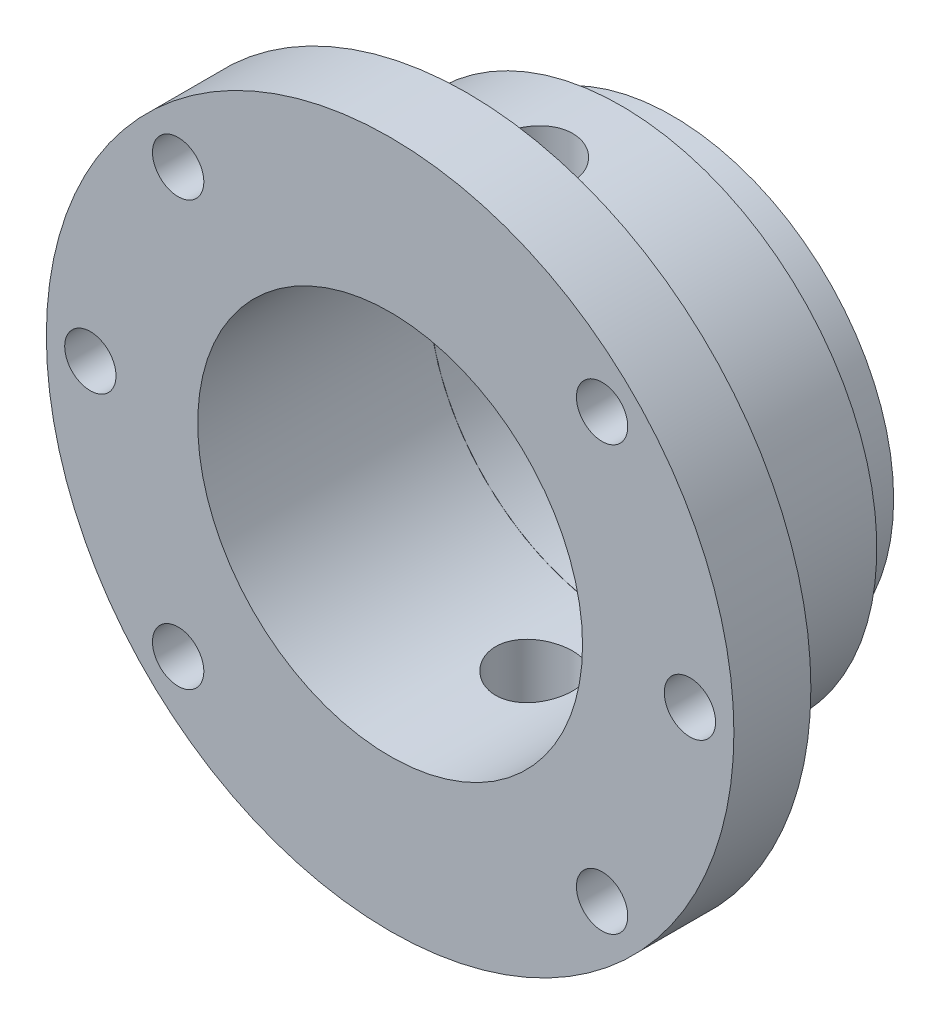
ISO-10303-21;
HEADER;
FILE_DESCRIPTION(('STEP AP214'),'2;1');
FILE_NAME('part.step','',(''),(''),'','','');
FILE_SCHEMA(('AUTOMOTIVE_DESIGN { 1 0 10303 214 1 1 1 1 }'));
ENDSEC;
DATA;
#1=APPLICATION_CONTEXT('core data for automotive mechanical design processes');
#2=APPLICATION_PROTOCOL_DEFINITION('international standard','automotive_design',2000,#1);
#3=PRODUCT_CONTEXT('',#1,'mechanical');
#4=PRODUCT('Part','Part','',(#3));
#5=PRODUCT_RELATED_PRODUCT_CATEGORY('part','',(#4));
#6=PRODUCT_DEFINITION_FORMATION('','',#4);
#7=PRODUCT_DEFINITION_CONTEXT('part definition',#1,'design');
#8=PRODUCT_DEFINITION('design','',#6,#7);
#9=PRODUCT_DEFINITION_SHAPE('','',#8);
#10=(LENGTH_UNIT() NAMED_UNIT(*) SI_UNIT(.MILLI.,.METRE.));
#11=(NAMED_UNIT(*) PLANE_ANGLE_UNIT() SI_UNIT($,.RADIAN.));
#12=(NAMED_UNIT(*) SI_UNIT($,.STERADIAN.) SOLID_ANGLE_UNIT());
#13=UNCERTAINTY_MEASURE_WITH_UNIT(LENGTH_MEASURE(1.E-05),#10,'distance_accuracy_value','');
#14=(GEOMETRIC_REPRESENTATION_CONTEXT(3) GLOBAL_UNCERTAINTY_ASSIGNED_CONTEXT((#13)) GLOBAL_UNIT_ASSIGNED_CONTEXT((#10,
#11,#12)) REPRESENTATION_CONTEXT('',''));
#15=CARTESIAN_POINT('',(0.,0.,0.));
#16=DIRECTION('',(0.,0.,1.));
#17=DIRECTION('',(1.,0.,0.));
#18=AXIS2_PLACEMENT_3D('',#15,#16,#17);
#19=CARTESIAN_POINT('',(0.,0.,18.));
#20=DIRECTION('',(0.,0.,-1.));
#21=DIRECTION('',(-1.,0.,0.));
#22=AXIS2_PLACEMENT_3D('',#19,#20,#21);
#23=CYLINDRICAL_SURFACE('',#22,15.);
#24=CARTESIAN_POINT('',(0.,15.,9.76650011293732));
#25=CARTESIAN_POINT('',(0.1667307203779,14.9999969274261,9.76649397944229));
#26=CARTESIAN_POINT('',(0.333538980604567,14.9971915553469,9.75255358403438));
#27=CARTESIAN_POINT('',(0.662440523067058,14.9862709686969,9.69720461259158));
#28=CARTESIAN_POINT('',(0.824529952624067,14.9781515358056,9.65577421453279));
#29=CARTESIAN_POINT('',(1.13919091578994,14.9575094783486,9.54677629207495));
#30=CARTESIAN_POINT('',(1.2917714037994,14.9449910723015,9.47923380240326));
#31=CARTESIAN_POINT('',(1.58342396659268,14.9169119410594,9.32000337040344));
#32=CARTESIAN_POINT('',(1.72249684522744,14.9013513970712,9.2283168661157));
#33=CARTESIAN_POINT('',(1.98508043194459,14.8686649598991,9.02208463006302));
#34=CARTESIAN_POINT('',(2.10838185347557,14.8515223651304,8.90727504676371));
#35=CARTESIAN_POINT('',(2.33411026982408,14.8177254135776,8.65862286376221));
#36=CARTESIAN_POINT('',(2.43653563431127,14.8010710950127,8.52477877893196));
#37=CARTESIAN_POINT('',(2.61849526004286,14.7699732543785,8.24035153390169));
#38=CARTESIAN_POINT('',(2.6978128165976,14.7555512209484,8.08962718154824));
#39=CARTESIAN_POINT('',(2.82991699974092,14.7307880417525,7.77665465592508));
#40=CARTESIAN_POINT('',(2.88270624731171,14.7204464928588,7.61440762289828));
#41=CARTESIAN_POINT('',(2.95957589965448,14.7051841575661,7.28524702121357));
#42=CARTESIAN_POINT('',(2.98402349387633,14.7001941032156,7.11842248051064));
#43=CARTESIAN_POINT('',(3.00465638317836,14.6959912518188,6.78297064884429));
#44=CARTESIAN_POINT('',(3.0008445681405,14.6967778640352,6.61434354397688));
#45=CARTESIAN_POINT('',(2.96536371930546,14.7039765344455,6.28275974887431));
#46=CARTESIAN_POINT('',(2.93411562073172,14.7103035857629,6.11975589605538));
#47=CARTESIAN_POINT('',(2.84531365386915,14.7277363848,5.80135188294831));
#48=CARTESIAN_POINT('',(2.78775852930204,14.7388423607334,5.6459520861803));
#49=CARTESIAN_POINT('',(2.64757435102416,14.7646685550122,5.34595432782652));
#50=CARTESIAN_POINT('',(2.56477845369634,14.7794126944111,5.2014364742298));
#51=CARTESIAN_POINT('',(2.37658072371804,14.8108385631919,4.92818756301888));
#52=CARTESIAN_POINT('',(2.27117629307049,14.827520515151,4.79945832238385));
#53=CARTESIAN_POINT('',(2.03849980368175,14.8613106372439,4.55901190556651));
#54=CARTESIAN_POINT('',(1.91086848363733,14.8784210763271,4.44764240935993));
#55=CARTESIAN_POINT('',(1.63855507218603,14.9108654614323,4.24783857403365));
#56=CARTESIAN_POINT('',(1.49387276213817,14.9261993846692,4.15940452905658));
#57=CARTESIAN_POINT('',(1.19117816063676,14.9534007048266,4.00791758525939));
#58=CARTESIAN_POINT('',(1.0331454587559,14.9652626654482,3.94490443200371));
#59=CARTESIAN_POINT('',(0.708446929345992,14.9841422696357,3.84641869082162));
#60=CARTESIAN_POINT('',(0.541782150217346,14.9911605000159,3.81094276671644));
#61=CARTESIAN_POINT('',(0.207538216881448,14.999480156006,3.76903075155449));
#62=CARTESIAN_POINT('',(0.0400209849767257,15.0008752395741,3.76211885431651));
#63=CARTESIAN_POINT('',(-0.293774802578145,14.9980515579031,3.77624968976386));
#64=CARTESIAN_POINT('',(-0.460053427331382,14.9938331082434,3.79729085099511));
#65=CARTESIAN_POINT('',(-0.785116979839625,14.9803149602405,3.86633523356919));
#66=CARTESIAN_POINT('',(-0.943955845019712,14.9710612921262,3.91409431843103));
#67=CARTESIAN_POINT('',(-1.251370882499,14.948506561831,4.03495206090475));
#68=CARTESIAN_POINT('',(-1.39994628491262,14.9352051964268,4.10805261696781));
#69=CARTESIAN_POINT('',(-1.68462352105865,14.9057973459988,4.27854758489126));
#70=CARTESIAN_POINT('',(-1.82055038025657,14.8896585131116,4.37622845605416));
#71=CARTESIAN_POINT('',(-2.07425405735762,14.8564420448965,4.59272768655917));
#72=CARTESIAN_POINT('',(-2.19202892679229,14.8393643090516,4.71154831213692));
#73=CARTESIAN_POINT('',(-2.40792177232253,14.8058791067089,4.96912016861069));
#74=CARTESIAN_POINT('',(-2.50571310734597,14.7894858069991,5.10814734560133));
#75=CARTESIAN_POINT('',(-2.67655626015362,14.7595257538858,5.40093419700736));
#76=CARTESIAN_POINT('',(-2.74960906776871,14.7459588874003,5.55469328165798));
#77=CARTESIAN_POINT('',(-2.86845552474588,14.7233022175315,5.87180485138597));
#78=CARTESIAN_POINT('',(-2.91439049937315,14.7141892461656,6.03510263656828));
#79=CARTESIAN_POINT('',(-2.97812595488159,14.7014231037608,6.36730047341004));
#80=CARTESIAN_POINT('',(-2.99593010467534,14.6977692207333,6.53619979156537));
#81=CARTESIAN_POINT('',(-3.0027627326024,14.6963744889414,6.87152670657028));
#82=CARTESIAN_POINT('',(-2.99230736421269,14.698527575679,7.03794355971835));
#83=CARTESIAN_POINT('',(-2.94405691230018,14.7082672045384,7.3665950626524));
#84=CARTESIAN_POINT('',(-2.90626204838789,14.7158537030151,7.52882974602174));
#85=CARTESIAN_POINT('',(-2.80463570549686,14.7355579265748,7.84418324665896));
#86=CARTESIAN_POINT('',(-2.74086752015203,14.7476646305649,7.99732319444457));
#87=CARTESIAN_POINT('',(-2.58916393380481,14.7750514492251,8.29081127514065));
#88=CARTESIAN_POINT('',(-2.50122650632464,14.7903318299668,8.43115833411274));
#89=CARTESIAN_POINT('',(-2.30191774435924,14.8226688156968,8.69764682938827));
#90=CARTESIAN_POINT('',(-2.19017366170554,14.839751187291,8.82350640874011));
#91=CARTESIAN_POINT('',(-1.94719310703942,14.8735824561586,9.05485872952483));
#92=CARTESIAN_POINT('',(-1.81595216146,14.8903312758955,9.16034678388914));
#93=CARTESIAN_POINT('',(-1.53605288726474,14.9218149716391,9.34900404477666));
#94=CARTESIAN_POINT('',(-1.3872266532895,14.9365269365774,9.4319281227774));
#95=CARTESIAN_POINT('',(-1.0774990828222,14.96205375255,9.5714584807271));
#96=CARTESIAN_POINT('',(-0.916608782589377,14.9728721141585,9.6280884815348));
#97=CARTESIAN_POINT('',(-0.629464466771337,14.9872911778611,9.70245595707147));
#98=CARTESIAN_POINT('',(-0.504844992041352,14.9920290947535,9.72642969406059));
#99=CARTESIAN_POINT('',(-0.2534985756302,14.9983846241968,9.75845385001241));
#100=CARTESIAN_POINT('',(-0.126771701245857,15.0000023361946,9.76650477646662));
#101=CARTESIAN_POINT('',(0.,15.,9.76650011293732));
#102=B_SPLINE_CURVE_WITH_KNOTS('',3,(#24,#25,#26,#27,#28,#29,#30,#31,#32,#33,#34,#35,#36,#37,
#38,#39,#40,#41,#42,#43,#44,#45,#46,#47,#48,#49,#50,#51,#52,#53,#54,#55,#56,#57,#58,#59,#60,#61,
#62,#63,#64,#65,#66,#67,#68,#69,#70,#71,#72,#73,#74,#75,#76,#77,#78,#79,#80,#81,#82,#83,#84,#85,
#86,#87,#88,#89,#90,#91,#92,#93,#94,#95,#96,#97,#98,#99,#100,#101),.UNSPECIFIED.,.T.,.F.,(4,2,2,
2,2,2,2,2,2,2,2,2,2,2,2,2,2,2,2,2,2,2,2,2,2,2,2,2,2,2,2,2,2,2,2,2,2,2,4),(0.,0.499728391983775,
0.999853952073969,1.49950120575103,1.99911870669259,2.50479801033656,3.0105167902421,
3.52083585017768,4.03110448095592,4.53468555310762,5.03821512843675,5.53415181018835,
6.03011217761189,6.52942470610778,7.02879464249011,7.53714757474052,8.04550702619461,
8.55465824562072,9.06374777094108,9.56432207028796,10.064868229736,10.5609136185217,
11.0569961764807,11.5591519810008,12.0613616503779,12.5712188573768,13.081055661704,
13.5882114309817,14.0953010499124,14.593191677031,15.0910783047783,15.5877588375933,
16.084481027456,16.5896422871743,17.0949196359879,17.6054849002691,18.1155886655256,
18.4955632586968,18.8755257411299),.UNSPECIFIED.);
#103=CARTESIAN_POINT('',(0.,15.,9.76650011293732));
#104=VERTEX_POINT('',#103);
#105=EDGE_CURVE('E70',#104,#104,#102,.T.);
#106=ORIENTED_EDGE('',*,*,#105,.T.);
#107=EDGE_LOOP('',(#106));
#108=FACE_BOUND('',#107,.T.);
#109=CARTESIAN_POINT('',(0.,0.,18.));
#110=DIRECTION('',(0.,0.,1.));
#111=DIRECTION('',(1.,0.,0.));
#112=AXIS2_PLACEMENT_3D('',#109,#110,#111);
#113=CIRCLE('',#112,15.);
#114=CARTESIAN_POINT('',(15.,0.,18.));
#115=VERTEX_POINT('',#114);
#116=EDGE_CURVE('E46',#115,#115,#113,.T.);
#117=ORIENTED_EDGE('',*,*,#116,.T.);
#118=EDGE_LOOP('',(#117));
#119=FACE_BOUND('',#118,.T.);
#120=CARTESIAN_POINT('',(0.,0.,0.));
#121=DIRECTION('',(0.,0.,1.));
#122=DIRECTION('',(1.,0.,0.));
#123=AXIS2_PLACEMENT_3D('',#120,#121,#122);
#124=CIRCLE('',#123,15.);
#125=CARTESIAN_POINT('',(15.,0.,0.));
#126=VERTEX_POINT('',#125);
#127=EDGE_CURVE('E127',#126,#126,#124,.T.);
#128=ORIENTED_EDGE('',*,*,#127,.F.);
#129=EDGE_LOOP('',(#128));
#130=FACE_BOUND('',#129,.T.);
#131=CARTESIAN_POINT('',(0.,-15.,9.76650011293732));
#132=CARTESIAN_POINT('',(-0.1667307203779,-14.9999969274261,9.76649397944229));
#133=CARTESIAN_POINT('',(-0.333538980604567,-14.9971915553469,9.75255358403438));
#134=CARTESIAN_POINT('',(-0.662440523067058,-14.9862709686969,9.69720461259158));
#135=CARTESIAN_POINT('',(-0.824529952624067,-14.9781515358056,9.65577421453279));
#136=CARTESIAN_POINT('',(-1.13919091578994,-14.9575094783486,9.54677629207495));
#137=CARTESIAN_POINT('',(-1.2917714037994,-14.9449910723015,9.47923380240326));
#138=CARTESIAN_POINT('',(-1.58342396659268,-14.9169119410594,9.32000337040344));
#139=CARTESIAN_POINT('',(-1.72249684522744,-14.9013513970712,9.2283168661157));
#140=CARTESIAN_POINT('',(-1.98508043194459,-14.8686649598991,9.02208463006302));
#141=CARTESIAN_POINT('',(-2.10838185347557,-14.8515223651304,8.90727504676371));
#142=CARTESIAN_POINT('',(-2.33411026982408,-14.8177254135776,8.65862286376221));
#143=CARTESIAN_POINT('',(-2.43653563431127,-14.8010710950127,8.52477877893196));
#144=CARTESIAN_POINT('',(-2.61849526004286,-14.7699732543785,8.24035153390169));
#145=CARTESIAN_POINT('',(-2.6978128165976,-14.7555512209484,8.08962718154824));
#146=CARTESIAN_POINT('',(-2.82991699974092,-14.7307880417525,7.77665465592508));
#147=CARTESIAN_POINT('',(-2.88270624731171,-14.7204464928588,7.61440762289828));
#148=CARTESIAN_POINT('',(-2.95957589965448,-14.7051841575661,7.28524702121357));
#149=CARTESIAN_POINT('',(-2.98402349387633,-14.7001941032156,7.11842248051064));
#150=CARTESIAN_POINT('',(-3.00465638317836,-14.6959912518188,6.78297064884429));
#151=CARTESIAN_POINT('',(-3.0008445681405,-14.6967778640352,6.61434354397688));
#152=CARTESIAN_POINT('',(-2.96536371930546,-14.7039765344455,6.28275974887431));
#153=CARTESIAN_POINT('',(-2.93411562073172,-14.7103035857629,6.11975589605538));
#154=CARTESIAN_POINT('',(-2.84531365386915,-14.7277363848,5.80135188294831));
#155=CARTESIAN_POINT('',(-2.78775852930204,-14.7388423607334,5.6459520861803));
#156=CARTESIAN_POINT('',(-2.64757435102416,-14.7646685550122,5.34595432782652));
#157=CARTESIAN_POINT('',(-2.56477845369634,-14.7794126944111,5.2014364742298));
#158=CARTESIAN_POINT('',(-2.37658072371804,-14.8108385631919,4.92818756301888));
#159=CARTESIAN_POINT('',(-2.27117629307049,-14.827520515151,4.79945832238385));
#160=CARTESIAN_POINT('',(-2.03849980368175,-14.8613106372439,4.55901190556651));
#161=CARTESIAN_POINT('',(-1.91086848363733,-14.8784210763271,4.44764240935993));
#162=CARTESIAN_POINT('',(-1.63855507218603,-14.9108654614323,4.24783857403365));
#163=CARTESIAN_POINT('',(-1.49387276213817,-14.9261993846692,4.15940452905658));
#164=CARTESIAN_POINT('',(-1.19117816063676,-14.9534007048266,4.00791758525939));
#165=CARTESIAN_POINT('',(-1.0331454587559,-14.9652626654482,3.94490443200371));
#166=CARTESIAN_POINT('',(-0.708446929345992,-14.9841422696357,3.84641869082162));
#167=CARTESIAN_POINT('',(-0.541782150217346,-14.9911605000159,3.81094276671644));
#168=CARTESIAN_POINT('',(-0.207538216881448,-14.999480156006,3.76903075155449));
#169=CARTESIAN_POINT('',(-0.0400209849767257,-15.0008752395741,3.76211885431651));
#170=CARTESIAN_POINT('',(0.293774802578145,-14.9980515579031,3.77624968976386));
#171=CARTESIAN_POINT('',(0.460053427331382,-14.9938331082434,3.79729085099511));
#172=CARTESIAN_POINT('',(0.785116979839625,-14.9803149602405,3.86633523356919));
#173=CARTESIAN_POINT('',(0.943955845019712,-14.9710612921262,3.91409431843103));
#174=CARTESIAN_POINT('',(1.251370882499,-14.948506561831,4.03495206090475));
#175=CARTESIAN_POINT('',(1.39994628491262,-14.9352051964268,4.10805261696781));
#176=CARTESIAN_POINT('',(1.68462352105865,-14.9057973459988,4.27854758489126));
#177=CARTESIAN_POINT('',(1.82055038025657,-14.8896585131116,4.37622845605416));
#178=CARTESIAN_POINT('',(2.07425405735762,-14.8564420448965,4.59272768655917));
#179=CARTESIAN_POINT('',(2.19202892679229,-14.8393643090516,4.71154831213692));
#180=CARTESIAN_POINT('',(2.40792177232253,-14.8058791067089,4.96912016861069));
#181=CARTESIAN_POINT('',(2.50571310734597,-14.7894858069991,5.10814734560133));
#182=CARTESIAN_POINT('',(2.67655626015362,-14.7595257538858,5.40093419700736));
#183=CARTESIAN_POINT('',(2.74960906776871,-14.7459588874003,5.55469328165798));
#184=CARTESIAN_POINT('',(2.86845552474588,-14.7233022175315,5.87180485138597));
#185=CARTESIAN_POINT('',(2.91439049937315,-14.7141892461656,6.03510263656828));
#186=CARTESIAN_POINT('',(2.97812595488159,-14.7014231037608,6.36730047341004));
#187=CARTESIAN_POINT('',(2.99593010467534,-14.6977692207333,6.53619979156537));
#188=CARTESIAN_POINT('',(3.0027627326024,-14.6963744889414,6.87152670657028));
#189=CARTESIAN_POINT('',(2.99230736421269,-14.698527575679,7.03794355971835));
#190=CARTESIAN_POINT('',(2.94405691230018,-14.7082672045384,7.3665950626524));
#191=CARTESIAN_POINT('',(2.90626204838789,-14.7158537030151,7.52882974602174));
#192=CARTESIAN_POINT('',(2.80463570549686,-14.7355579265748,7.84418324665896));
#193=CARTESIAN_POINT('',(2.74086752015203,-14.7476646305649,7.99732319444457));
#194=CARTESIAN_POINT('',(2.58916393380481,-14.7750514492251,8.29081127514065));
#195=CARTESIAN_POINT('',(2.50122650632464,-14.7903318299668,8.43115833411274));
#196=CARTESIAN_POINT('',(2.30191774435924,-14.8226688156968,8.69764682938827));
#197=CARTESIAN_POINT('',(2.19017366170554,-14.839751187291,8.82350640874011));
#198=CARTESIAN_POINT('',(1.94719310703942,-14.8735824561586,9.05485872952483));
#199=CARTESIAN_POINT('',(1.81595216146,-14.8903312758955,9.16034678388914));
#200=CARTESIAN_POINT('',(1.53605288726474,-14.9218149716391,9.34900404477666));
#201=CARTESIAN_POINT('',(1.3872266532895,-14.9365269365774,9.4319281227774));
#202=CARTESIAN_POINT('',(1.0774990828222,-14.96205375255,9.5714584807271));
#203=CARTESIAN_POINT('',(0.916608782589377,-14.9728721141585,9.6280884815348));
#204=CARTESIAN_POINT('',(0.629464466771337,-14.9872911778611,9.70245595707147));
#205=CARTESIAN_POINT('',(0.504844992041352,-14.9920290947535,9.72642969406059));
#206=CARTESIAN_POINT('',(0.2534985756302,-14.9983846241968,9.75845385001241));
#207=CARTESIAN_POINT('',(0.126771701245857,-15.0000023361946,9.76650477646662));
#208=CARTESIAN_POINT('',(0.,-15.,9.76650011293732));
#209=B_SPLINE_CURVE_WITH_KNOTS('',3,(#131,#132,#133,#134,#135,#136,#137,#138,#139,#140,#141,
#142,#143,#144,#145,#146,#147,#148,#149,#150,#151,#152,#153,#154,#155,#156,#157,#158,#159,#160,
#161,#162,#163,#164,#165,#166,#167,#168,#169,#170,#171,#172,#173,#174,#175,#176,#177,#178,#179,
#180,#181,#182,#183,#184,#185,#186,#187,#188,#189,#190,#191,#192,#193,#194,#195,#196,#197,#198,
#199,#200,#201,#202,#203,#204,#205,#206,#207,#208),.UNSPECIFIED.,.T.,.F.,(4,2,2,2,2,2,2,2,2,2,2,
2,2,2,2,2,2,2,2,2,2,2,2,2,2,2,2,2,2,2,2,2,2,2,2,2,2,2,4),(0.,0.499728391983775,
0.999853952073969,1.49950120575103,1.99911870669259,2.50479801033656,3.0105167902421,
3.52083585017768,4.03110448095592,4.53468555310762,5.03821512843675,5.53415181018835,
6.03011217761189,6.52942470610778,7.02879464249011,7.53714757474052,8.04550702619461,
8.55465824562072,9.06374777094108,9.56432207028796,10.064868229736,10.5609136185217,
11.0569961764807,11.5591519810008,12.0613616503779,12.5712188573768,13.081055661704,
13.5882114309817,14.0953010499124,14.593191677031,15.0910783047783,15.5877588375933,
16.084481027456,16.5896422871743,17.0949196359879,17.6054849002691,18.1155886655256,
18.4955632586968,18.8755257411299),.UNSPECIFIED.);
#210=CARTESIAN_POINT('',(0.,-15.,9.76650011293732));
#211=VERTEX_POINT('',#210);
#212=EDGE_CURVE('E75',#211,#211,#209,.T.);
#213=ORIENTED_EDGE('',*,*,#212,.T.);
#214=EDGE_LOOP('',(#213));
#215=FACE_BOUND('',#214,.T.);
#216=ADVANCED_FACE('F29',(#108,#119,#130,#215),#23,.F.);
#217=CARTESIAN_POINT('',(0.,0.,12.));
#218=DIRECTION('',(0.,0.,-1.));
#219=DIRECTION('',(-1.,0.,0.));
#220=AXIS2_PLACEMENT_3D('',#217,#218,#219);
#221=CYLINDRICAL_SURFACE('',#220,19.94);
#222=CARTESIAN_POINT('',(0.,19.94,9.76650011293732));
#223=CARTESIAN_POINT('',(-0.167497064694044,19.9399973099574,9.76649321012849));
#224=CARTESIAN_POINT('',(-0.335091170093798,19.9378674093283,9.7524251227857));
#225=CARTESIAN_POINT('',(-0.665594465181485,19.9295758044148,9.69653895855381));
#226=CARTESIAN_POINT('',(-0.828498938952122,19.9234101801438,9.65469390072686));
#227=CARTESIAN_POINT('',(-1.14479213609882,19.9077399706725,9.54453279096298));
#228=CARTESIAN_POINT('',(-1.29818796507478,19.8982379149838,9.47623678874931));
#229=CARTESIAN_POINT('',(-1.59131879763683,19.8769446824652,9.31516154557242));
#230=CARTESIAN_POINT('',(-1.73105568617224,19.8651538221654,9.22238568941262));
#231=CARTESIAN_POINT('',(-1.99402330008599,19.8404904591525,9.01420762043298));
#232=CARTESIAN_POINT('',(-2.11713115696255,19.8276109389644,8.89865101683647));
#233=CARTESIAN_POINT('',(-2.34228601231619,19.8022767537509,8.64852390759898));
#234=CARTESIAN_POINT('',(-2.44433179645214,19.7898221132566,8.51395230639484));
#235=CARTESIAN_POINT('',(-2.62494444712185,19.7666797401215,8.22878919139385));
#236=CARTESIAN_POINT('',(-2.70339236889438,19.7560010761144,8.07812154219475));
#237=CARTESIAN_POINT('',(-2.83382230284214,19.7377155597676,7.7655611974732));
#238=CARTESIAN_POINT('',(-2.88580576625653,19.730108538992,7.60366911802135));
#239=CARTESIAN_POINT('',(-2.96144944309354,19.7188965989407,7.27454787463037));
#240=CARTESIAN_POINT('',(-2.9853200505996,19.7152619656347,7.10736809742733));
#241=CARTESIAN_POINT('',(-3.00471221141079,19.7123161183787,6.7713393751718));
#242=CARTESIAN_POINT('',(-3.00023540211477,19.7130046547145,6.6024905270904));
#243=CARTESIAN_POINT('',(-2.96323173347676,19.7186001813291,6.26940332312357));
#244=CARTESIAN_POINT('',(-2.93093925461818,19.723471922006,6.10513825171999));
#245=CARTESIAN_POINT('',(-2.83958783474,19.7368298654336,5.78438483372195));
#246=CARTESIAN_POINT('',(-2.78052813234808,19.7453161709972,5.62789670847702));
#247=CARTESIAN_POINT('',(-2.63707514018572,19.7649859621486,5.32642648697323));
#248=CARTESIAN_POINT('',(-2.55258262344577,19.7761799777336,5.18149232252903));
#249=CARTESIAN_POINT('',(-2.36073309703412,19.799996298491,4.9077703071577));
#250=CARTESIAN_POINT('',(-2.25337457780796,19.8126186979359,4.77898352313116));
#251=CARTESIAN_POINT('',(-2.01755425839548,19.8380252769476,4.53985371848884));
#252=CARTESIAN_POINT('',(-1.8888909569043,19.8508098062621,4.42970935062805));
#253=CARTESIAN_POINT('',(-1.6147999866491,19.874982190658,4.23254660233852));
#254=CARTESIAN_POINT('',(-1.46937224367519,19.8863700395564,4.14552832428592));
#255=CARTESIAN_POINT('',(-1.1657079806456,19.9064779633974,3.99707746161332));
#256=CARTESIAN_POINT('',(-1.00746382660425,19.9151964333482,3.9356602619186));
#257=CARTESIAN_POINT('',(-0.682747089382336,19.92896985316,3.84032797334023));
#258=CARTESIAN_POINT('',(-0.516275066684499,19.9340250521967,3.80641101387113));
#259=CARTESIAN_POINT('',(-0.181542579788986,19.9398693301229,3.76730627215238));
#260=CARTESIAN_POINT('',(-0.0133147018645752,19.9406989607185,3.76184539237129));
#261=CARTESIAN_POINT('',(0.321654458728248,19.9381090279166,3.77908285509474));
#262=CARTESIAN_POINT('',(0.488395787540581,19.9346895968798,3.80178032045024));
#263=CARTESIAN_POINT('',(0.814831037210112,19.924010837196,3.87446308308858));
#264=CARTESIAN_POINT('',(0.974555260580506,19.9167702444185,3.92431527368874));
#265=CARTESIAN_POINT('',(1.28337830277493,19.8992583876667,4.0497519589038));
#266=CARTESIAN_POINT('',(1.43247661960567,19.8889869806272,4.12533766825855));
#267=CARTESIAN_POINT('',(1.71701598343994,19.8664541289974,4.30073610119856));
#268=CARTESIAN_POINT('',(1.85234915541963,19.8541786775991,4.40072199204246));
#269=CARTESIAN_POINT('',(2.10441224546947,19.8290474920565,4.62184153470901));
#270=CARTESIAN_POINT('',(2.22114107472537,19.8161917240058,4.74297642340247));
#271=CARTESIAN_POINT('',(2.43367615942327,19.7912201812952,5.0041713972191));
#272=CARTESIAN_POINT('',(2.52929930920508,19.7791114929179,5.14438125663454));
#273=CARTESIAN_POINT('',(2.69563573773094,19.7571307891167,5.43903361610346));
#274=CARTESIAN_POINT('',(2.76634969268436,19.7472587129782,5.59347572965062));
#275=CARTESIAN_POINT('',(2.88057689324863,19.7309203231572,5.91166342827426));
#276=CARTESIAN_POINT('',(2.92418636171339,19.724441974527,6.07537382476152));
#277=CARTESIAN_POINT('',(2.98327283085171,19.7155925836909,6.40789982300738));
#278=CARTESIAN_POINT('',(2.99875178704814,19.7132212559814,6.57671506906737));
#279=CARTESIAN_POINT('',(3.00109111312383,19.7128650985783,6.91283355559182));
#280=CARTESIAN_POINT('',(2.98823939694064,19.7148361389119,7.08013481657289));
#281=CARTESIAN_POINT('',(2.93489932015003,19.7228467011242,7.4101677325573));
#282=CARTESIAN_POINT('',(2.89441100490791,19.7288862163246,7.57289939506117));
#283=CARTESIAN_POINT('',(2.78704907462544,19.7443377640062,7.88909315241481));
#284=CARTESIAN_POINT('',(2.72019570408284,19.7537472083679,8.04256225554427));
#285=CARTESIAN_POINT('',(2.56203006652724,19.7748815427653,8.33615245153428));
#286=CARTESIAN_POINT('',(2.47071696126291,19.7866065121521,8.47627308671082));
#287=CARTESIAN_POINT('',(2.26517837321694,19.8111926160415,8.74065140352096));
#288=CARTESIAN_POINT('',(2.15073969158853,19.8240636483862,8.86474243437428));
#289=CARTESIAN_POINT('',(1.90264897364223,19.8494091049996,9.0920616217767));
#290=CARTESIAN_POINT('',(1.76899247854797,19.8618834364062,9.19528492333895));
#291=CARTESIAN_POINT('',(1.48538898411489,19.8851089243207,9.37844959941062));
#292=CARTESIAN_POINT('',(1.3353558532082,19.895850153555,9.45825884983978));
#293=CARTESIAN_POINT('',(1.02392316651128,19.9143018521726,9.59142539813306));
#294=CARTESIAN_POINT('',(0.862535569730228,19.922015455656,9.64481006490067));
#295=CARTESIAN_POINT('',(0.583688938792078,19.9317840746712,9.71151484888044));
#296=CARTESIAN_POINT('',(0.467950213429277,19.9348492062923,9.73210277058168));
#297=CARTESIAN_POINT('',(0.234823545677201,19.9389580993059,9.75959773669014));
#298=CARTESIAN_POINT('',(0.11743562398558,19.940001886044,9.76650495263803));
#299=CARTESIAN_POINT('',(0.,19.94,9.76650011293732));
#300=B_SPLINE_CURVE_WITH_KNOTS('',3,(#222,#223,#224,#225,#226,#227,#228,#229,#230,#231,#232,
#233,#234,#235,#236,#237,#238,#239,#240,#241,#242,#243,#244,#245,#246,#247,#248,#249,#250,#251,
#252,#253,#254,#255,#256,#257,#258,#259,#260,#261,#262,#263,#264,#265,#266,#267,#268,#269,#270,
#271,#272,#273,#274,#275,#276,#277,#278,#279,#280,#281,#282,#283,#284,#285,#286,#287,#288,#289,
#290,#291,#292,#293,#294,#295,#296,#297,#298,#299),.UNSPECIFIED.,.T.,.F.,(4,2,2,2,2,2,2,2,2,2,2,
2,2,2,2,2,2,2,2,2,2,2,2,2,2,2,2,2,2,2,2,2,2,2,2,2,2,2,4),(0.,0.502062067795975,1.00461252456992,
1.50678279304799,2.00888366332808,2.51451224357378,3.02016996787253,3.52833531760955,
4.03647279793407,4.54078275723629,5.04506358693495,5.54513635349204,6.04522334511268,
6.54728730485238,7.04938441983834,7.5565344174249,8.06368666006002,8.57114323712831,
9.07856529375102,9.58110845015716,10.0836359524413,10.5837220531515,11.083831763488,
11.587599585629,12.0913968798314,12.5994066861266,13.1074027004274,13.6135848347334,
14.1197317798967,14.620758679653,15.1217847569791,15.6224268664397,16.1230861354332,
16.6285909169288,17.1342131717607,17.6426360380735,18.1505312046467,18.5025416212143,
18.8545476239392),.UNSPECIFIED.);
#301=CARTESIAN_POINT('',(0.,19.94,9.76650011293732));
#302=VERTEX_POINT('',#301);
#303=EDGE_CURVE('E49',#302,#302,#300,.T.);
#304=ORIENTED_EDGE('',*,*,#303,.T.);
#305=EDGE_LOOP('',(#304));
#306=FACE_BOUND('',#305,.T.);
#307=CARTESIAN_POINT('',(0.,0.,12.));
#308=DIRECTION('',(0.,0.,-1.));
#309=DIRECTION('',(-1.,0.,0.));
#310=AXIS2_PLACEMENT_3D('',#307,#308,#309);
#311=CIRCLE('',#310,19.94);
#312=CARTESIAN_POINT('',(-19.94,0.,12.));
#313=VERTEX_POINT('',#312);
#314=EDGE_CURVE('E105',#313,#313,#311,.T.);
#315=ORIENTED_EDGE('',*,*,#314,.T.);
#316=EDGE_LOOP('',(#315));
#317=FACE_BOUND('',#316,.T.);
#318=CARTESIAN_POINT('',(0.,0.,0.));
#319=DIRECTION('',(0.,0.,-1.));
#320=DIRECTION('',(-1.,0.,0.));
#321=AXIS2_PLACEMENT_3D('',#318,#319,#320);
#322=CIRCLE('',#321,19.94);
#323=CARTESIAN_POINT('',(-19.94,0.,0.));
#324=VERTEX_POINT('',#323);
#325=EDGE_CURVE('E103',#324,#324,#322,.T.);
#326=ORIENTED_EDGE('',*,*,#325,.F.);
#327=EDGE_LOOP('',(#326));
#328=FACE_BOUND('',#327,.T.);
#329=CARTESIAN_POINT('',(0.,-19.94,9.76650011293732));
#330=CARTESIAN_POINT('',(0.167497064694044,-19.9399973099574,9.76649321012849));
#331=CARTESIAN_POINT('',(0.335091170093798,-19.9378674093283,9.7524251227857));
#332=CARTESIAN_POINT('',(0.665594465181485,-19.9295758044148,9.69653895855381));
#333=CARTESIAN_POINT('',(0.828498938952122,-19.9234101801438,9.65469390072686));
#334=CARTESIAN_POINT('',(1.14479213609882,-19.9077399706725,9.54453279096298));
#335=CARTESIAN_POINT('',(1.29818796507478,-19.8982379149838,9.47623678874931));
#336=CARTESIAN_POINT('',(1.59131879763683,-19.8769446824652,9.31516154557242));
#337=CARTESIAN_POINT('',(1.73105568617224,-19.8651538221654,9.22238568941262));
#338=CARTESIAN_POINT('',(1.99402330008599,-19.8404904591525,9.01420762043298));
#339=CARTESIAN_POINT('',(2.11713115696255,-19.8276109389644,8.89865101683647));
#340=CARTESIAN_POINT('',(2.34228601231619,-19.8022767537509,8.64852390759898));
#341=CARTESIAN_POINT('',(2.44433179645214,-19.7898221132566,8.51395230639484));
#342=CARTESIAN_POINT('',(2.62494444712185,-19.7666797401215,8.22878919139385));
#343=CARTESIAN_POINT('',(2.70339236889438,-19.7560010761144,8.07812154219475));
#344=CARTESIAN_POINT('',(2.83382230284214,-19.7377155597676,7.7655611974732));
#345=CARTESIAN_POINT('',(2.88580576625653,-19.730108538992,7.60366911802135));
#346=CARTESIAN_POINT('',(2.96144944309354,-19.7188965989407,7.27454787463037));
#347=CARTESIAN_POINT('',(2.9853200505996,-19.7152619656347,7.10736809742733));
#348=CARTESIAN_POINT('',(3.00471221141079,-19.7123161183787,6.7713393751718));
#349=CARTESIAN_POINT('',(3.00023540211477,-19.7130046547145,6.6024905270904));
#350=CARTESIAN_POINT('',(2.96323173347676,-19.7186001813291,6.26940332312357));
#351=CARTESIAN_POINT('',(2.93093925461818,-19.723471922006,6.10513825171999));
#352=CARTESIAN_POINT('',(2.83958783474,-19.7368298654336,5.78438483372195));
#353=CARTESIAN_POINT('',(2.78052813234808,-19.7453161709972,5.62789670847702));
#354=CARTESIAN_POINT('',(2.63707514018572,-19.7649859621486,5.32642648697323));
#355=CARTESIAN_POINT('',(2.55258262344577,-19.7761799777336,5.18149232252903));
#356=CARTESIAN_POINT('',(2.36073309703412,-19.799996298491,4.9077703071577));
#357=CARTESIAN_POINT('',(2.25337457780796,-19.8126186979359,4.77898352313116));
#358=CARTESIAN_POINT('',(2.01755425839548,-19.8380252769476,4.53985371848884));
#359=CARTESIAN_POINT('',(1.8888909569043,-19.8508098062621,4.42970935062805));
#360=CARTESIAN_POINT('',(1.6147999866491,-19.874982190658,4.23254660233852));
#361=CARTESIAN_POINT('',(1.46937224367519,-19.8863700395564,4.14552832428592));
#362=CARTESIAN_POINT('',(1.1657079806456,-19.9064779633974,3.99707746161332));
#363=CARTESIAN_POINT('',(1.00746382660425,-19.9151964333482,3.9356602619186));
#364=CARTESIAN_POINT('',(0.682747089382336,-19.92896985316,3.84032797334023));
#365=CARTESIAN_POINT('',(0.516275066684499,-19.9340250521967,3.80641101387113));
#366=CARTESIAN_POINT('',(0.181542579788986,-19.9398693301229,3.76730627215238));
#367=CARTESIAN_POINT('',(0.0133147018645752,-19.9406989607185,3.76184539237129));
#368=CARTESIAN_POINT('',(-0.321654458728248,-19.9381090279166,3.77908285509474));
#369=CARTESIAN_POINT('',(-0.488395787540581,-19.9346895968798,3.80178032045024));
#370=CARTESIAN_POINT('',(-0.814831037210112,-19.924010837196,3.87446308308858));
#371=CARTESIAN_POINT('',(-0.974555260580506,-19.9167702444185,3.92431527368874));
#372=CARTESIAN_POINT('',(-1.28337830277493,-19.8992583876667,4.0497519589038));
#373=CARTESIAN_POINT('',(-1.43247661960567,-19.8889869806272,4.12533766825855));
#374=CARTESIAN_POINT('',(-1.71701598343994,-19.8664541289974,4.30073610119856));
#375=CARTESIAN_POINT('',(-1.85234915541963,-19.8541786775991,4.40072199204246));
#376=CARTESIAN_POINT('',(-2.10441224546947,-19.8290474920565,4.62184153470901));
#377=CARTESIAN_POINT('',(-2.22114107472537,-19.8161917240058,4.74297642340247));
#378=CARTESIAN_POINT('',(-2.43367615942327,-19.7912201812952,5.0041713972191));
#379=CARTESIAN_POINT('',(-2.52929930920508,-19.7791114929179,5.14438125663454));
#380=CARTESIAN_POINT('',(-2.69563573773094,-19.7571307891167,5.43903361610346));
#381=CARTESIAN_POINT('',(-2.76634969268436,-19.7472587129782,5.59347572965062));
#382=CARTESIAN_POINT('',(-2.88057689324863,-19.7309203231572,5.91166342827426));
#383=CARTESIAN_POINT('',(-2.92418636171339,-19.724441974527,6.07537382476152));
#384=CARTESIAN_POINT('',(-2.98327283085171,-19.7155925836909,6.40789982300738));
#385=CARTESIAN_POINT('',(-2.99875178704814,-19.7132212559814,6.57671506906737));
#386=CARTESIAN_POINT('',(-3.00109111312383,-19.7128650985783,6.91283355559182));
#387=CARTESIAN_POINT('',(-2.98823939694064,-19.7148361389119,7.08013481657289));
#388=CARTESIAN_POINT('',(-2.93489932015003,-19.7228467011242,7.4101677325573));
#389=CARTESIAN_POINT('',(-2.89441100490791,-19.7288862163246,7.57289939506117));
#390=CARTESIAN_POINT('',(-2.78704907462544,-19.7443377640062,7.88909315241481));
#391=CARTESIAN_POINT('',(-2.72019570408284,-19.7537472083679,8.04256225554427));
#392=CARTESIAN_POINT('',(-2.56203006652724,-19.7748815427653,8.33615245153428));
#393=CARTESIAN_POINT('',(-2.47071696126291,-19.7866065121521,8.47627308671082));
#394=CARTESIAN_POINT('',(-2.26517837321694,-19.8111926160415,8.74065140352096));
#395=CARTESIAN_POINT('',(-2.15073969158853,-19.8240636483862,8.86474243437428));
#396=CARTESIAN_POINT('',(-1.90264897364223,-19.8494091049996,9.0920616217767));
#397=CARTESIAN_POINT('',(-1.76899247854797,-19.8618834364062,9.19528492333895));
#398=CARTESIAN_POINT('',(-1.48538898411489,-19.8851089243207,9.37844959941062));
#399=CARTESIAN_POINT('',(-1.3353558532082,-19.895850153555,9.45825884983978));
#400=CARTESIAN_POINT('',(-1.02392316651128,-19.9143018521726,9.59142539813306));
#401=CARTESIAN_POINT('',(-0.862535569730228,-19.922015455656,9.64481006490067));
#402=CARTESIAN_POINT('',(-0.583688938792078,-19.9317840746712,9.71151484888044));
#403=CARTESIAN_POINT('',(-0.467950213429277,-19.9348492062923,9.73210277058168));
#404=CARTESIAN_POINT('',(-0.234823545677201,-19.9389580993059,9.75959773669014));
#405=CARTESIAN_POINT('',(-0.11743562398558,-19.940001886044,9.76650495263803));
#406=CARTESIAN_POINT('',(0.,-19.94,9.76650011293732));
#407=B_SPLINE_CURVE_WITH_KNOTS('',3,(#329,#330,#331,#332,#333,#334,#335,#336,#337,#338,#339,
#340,#341,#342,#343,#344,#345,#346,#347,#348,#349,#350,#351,#352,#353,#354,#355,#356,#357,#358,
#359,#360,#361,#362,#363,#364,#365,#366,#367,#368,#369,#370,#371,#372,#373,#374,#375,#376,#377,
#378,#379,#380,#381,#382,#383,#384,#385,#386,#387,#388,#389,#390,#391,#392,#393,#394,#395,#396,
#397,#398,#399,#400,#401,#402,#403,#404,#405,#406),.UNSPECIFIED.,.T.,.F.,(4,2,2,2,2,2,2,2,2,2,2,
2,2,2,2,2,2,2,2,2,2,2,2,2,2,2,2,2,2,2,2,2,2,2,2,2,2,2,4),(0.,0.502062067795975,1.00461252456992,
1.50678279304799,2.00888366332808,2.51451224357378,3.02016996787253,3.52833531760955,
4.03647279793407,4.54078275723629,5.04506358693495,5.54513635349204,6.04522334511268,
6.54728730485238,7.04938441983834,7.5565344174249,8.06368666006002,8.57114323712831,
9.07856529375102,9.58110845015716,10.0836359524413,10.5837220531515,11.083831763488,
11.587599585629,12.0913968798314,12.5994066861266,13.1074027004274,13.6135848347334,
14.1197317798967,14.620758679653,15.1217847569791,15.6224268664397,16.1230861354332,
16.6285909169288,17.1342131717607,17.6426360380735,18.1505312046467,18.5025416212143,
18.8545476239392),.UNSPECIFIED.);
#408=CARTESIAN_POINT('',(0.,-19.94,9.76650011293732));
#409=VERTEX_POINT('',#408);
#410=EDGE_CURVE('E33',#409,#409,#407,.T.);
#411=ORIENTED_EDGE('',*,*,#410,.T.);
#412=EDGE_LOOP('',(#411));
#413=FACE_BOUND('',#412,.T.);
#414=ADVANCED_FACE('F53',(#306,#317,#328,#413),#221,.T.);
#415=CARTESIAN_POINT('',(0.,0.,0.));
#416=DIRECTION('',(0.,0.,1.));
#417=DIRECTION('',(1.,0.,0.));
#418=AXIS2_PLACEMENT_3D('',#415,#416,#417);
#419=PLANE('',#418);
#420=CARTESIAN_POINT('',(0.,0.,0.));
#421=DIRECTION('',(0.,0.,1.));
#422=DIRECTION('',(1.,0.,0.));
#423=AXIS2_PLACEMENT_3D('',#420,#421,#422);
#424=CIRCLE('',#423,17.253);
#425=CARTESIAN_POINT('',(17.253,0.,0.));
#426=VERTEX_POINT('',#425);
#427=EDGE_CURVE('E10',#426,#426,#424,.F.);
#428=ORIENTED_EDGE('',*,*,#427,.F.);
#429=EDGE_LOOP('',(#428));
#430=FACE_BOUND('',#429,.T.);
#431=ORIENTED_EDGE('',*,*,#325,.T.);
#432=EDGE_LOOP('',(#431));
#433=FACE_BOUND('',#432,.T.);
#434=ADVANCED_FACE('F91',(#430,#433),#419,.F.);
#435=CARTESIAN_POINT('',(0.,0.,18.));
#436=DIRECTION('',(0.,0.,-1.));
#437=DIRECTION('',(-1.,0.,0.));
#438=AXIS2_PLACEMENT_3D('',#435,#436,#437);
#439=CYLINDRICAL_SURFACE('',#438,26.8);
#440=CARTESIAN_POINT('',(0.,0.,18.));
#441=DIRECTION('',(0.,0.,1.));
#442=DIRECTION('',(1.,0.,0.));
#443=AXIS2_PLACEMENT_3D('',#440,#441,#442);
#444=CIRCLE('',#443,26.8);
#445=CARTESIAN_POINT('',(26.8,0.,18.));
#446=VERTEX_POINT('',#445);
#447=EDGE_CURVE('E41',#446,#446,#444,.T.);
#448=ORIENTED_EDGE('',*,*,#447,.F.);
#449=EDGE_LOOP('',(#448));
#450=FACE_BOUND('',#449,.T.);
#451=CARTESIAN_POINT('',(0.,0.,12.));
#452=DIRECTION('',(0.,0.,-1.));
#453=DIRECTION('',(-1.,0.,0.));
#454=AXIS2_PLACEMENT_3D('',#451,#452,#453);
#455=CIRCLE('',#454,26.8);
#456=CARTESIAN_POINT('',(-26.8,0.,12.));
#457=VERTEX_POINT('',#456);
#458=EDGE_CURVE('E109',#457,#457,#455,.T.);
#459=ORIENTED_EDGE('',*,*,#458,.F.);
#460=EDGE_LOOP('',(#459));
#461=FACE_BOUND('',#460,.T.);
#462=ADVANCED_FACE('F31',(#450,#461),#439,.T.);
#463=CARTESIAN_POINT('',(0.,0.,18.));
#464=DIRECTION('',(0.,0.,1.));
#465=DIRECTION('',(1.,0.,0.));
#466=AXIS2_PLACEMENT_3D('',#463,#464,#465);
#467=PLANE('',#466);
#468=CARTESIAN_POINT('',(16.5250854763298,-16.5250854763294,18.));
#469=DIRECTION('',(0.,0.,-1.));
#470=DIRECTION('',(-1.,0.,0.));
#471=AXIS2_PLACEMENT_3D('',#468,#469,#470);
#472=CIRCLE('',#471,2.);
#473=CARTESIAN_POINT('',(14.5250854763298,-16.5250854763294,18.));
#474=VERTEX_POINT('',#473);
#475=EDGE_CURVE('E141',#474,#474,#472,.T.);
#476=ORIENTED_EDGE('',*,*,#475,.T.);
#477=EDGE_LOOP('',(#476));
#478=FACE_BOUND('',#477,.T.);
#479=CARTESIAN_POINT('',(-16.5250854763295,-16.5250854763298,18.));
#480=DIRECTION('',(0.,0.,-1.));
#481=DIRECTION('',(-1.,0.,0.));
#482=AXIS2_PLACEMENT_3D('',#479,#480,#481);
#483=CIRCLE('',#482,2.);
#484=CARTESIAN_POINT('',(-18.5250854763295,-16.5250854763298,18.));
#485=VERTEX_POINT('',#484);
#486=EDGE_CURVE('E148',#485,#485,#483,.T.);
#487=ORIENTED_EDGE('',*,*,#486,.T.);
#488=EDGE_LOOP('',(#487));
#489=FACE_BOUND('',#488,.T.);
#490=CARTESIAN_POINT('',(-23.37,-1.63191932298253E-13,18.));
#491=DIRECTION('',(0.,0.,-1.));
#492=DIRECTION('',(-1.,0.,0.));
#493=AXIS2_PLACEMENT_3D('',#490,#491,#492);
#494=CIRCLE('',#493,2.);
#495=CARTESIAN_POINT('',(-25.37,-1.63191932298253E-13,18.));
#496=VERTEX_POINT('',#495);
#497=EDGE_CURVE('E154',#496,#496,#494,.T.);
#498=ORIENTED_EDGE('',*,*,#497,.T.);
#499=EDGE_LOOP('',(#498));
#500=FACE_BOUND('',#499,.T.);
#501=CARTESIAN_POINT('',(-16.5250854763297,16.5250854763295,18.));
#502=DIRECTION('',(0.,0.,-1.));
#503=DIRECTION('',(-1.,0.,0.));
#504=AXIS2_PLACEMENT_3D('',#501,#502,#503);
#505=CIRCLE('',#504,2.);
#506=CARTESIAN_POINT('',(-18.5250854763297,16.5250854763295,18.));
#507=VERTEX_POINT('',#506);
#508=EDGE_CURVE('E160',#507,#507,#505,.T.);
#509=ORIENTED_EDGE('',*,*,#508,.T.);
#510=EDGE_LOOP('',(#509));
#511=FACE_BOUND('',#510,.T.);
#512=CARTESIAN_POINT('',(16.5250854763296,16.5250854763296,18.));
#513=DIRECTION('',(0.,0.,-1.));
#514=DIRECTION('',(-1.,0.,0.));
#515=AXIS2_PLACEMENT_3D('',#512,#513,#514);
#516=CIRCLE('',#515,2.);
#517=CARTESIAN_POINT('',(14.5250854763296,16.5250854763296,18.));
#518=VERTEX_POINT('',#517);
#519=EDGE_CURVE('E166',#518,#518,#516,.T.);
#520=ORIENTED_EDGE('',*,*,#519,.T.);
#521=EDGE_LOOP('',(#520));
#522=FACE_BOUND('',#521,.T.);
#523=CARTESIAN_POINT('',(23.37,0.,18.));
#524=DIRECTION('',(0.,0.,-1.));
#525=DIRECTION('',(-1.,0.,0.));
#526=AXIS2_PLACEMENT_3D('',#523,#524,#525);
#527=CIRCLE('',#526,2.);
#528=CARTESIAN_POINT('',(21.37,0.,18.));
#529=VERTEX_POINT('',#528);
#530=EDGE_CURVE('E106',#529,#529,#527,.T.);
#531=ORIENTED_EDGE('',*,*,#530,.T.);
#532=EDGE_LOOP('',(#531));
#533=FACE_BOUND('',#532,.T.);
#534=ORIENTED_EDGE('',*,*,#447,.T.);
#535=EDGE_LOOP('',(#534));
#536=FACE_BOUND('',#535,.T.);
#537=ORIENTED_EDGE('',*,*,#116,.F.);
#538=EDGE_LOOP('',(#537));
#539=FACE_BOUND('',#538,.T.);
#540=ADVANCED_FACE('F86',(#478,#489,#500,#511,#522,#533,#536,#539),#467,.T.);
#541=CARTESIAN_POINT('',(0.,0.,-4.));
#542=DIRECTION('',(0.,0.,-1.));
#543=DIRECTION('',(-1.,0.,0.));
#544=AXIS2_PLACEMENT_3D('',#541,#542,#543);
#545=PLANE('',#544);
#546=CARTESIAN_POINT('',(0.,0.,-4.));
#547=DIRECTION('',(0.,0.,-1.));
#548=DIRECTION('',(-1.,0.,0.));
#549=AXIS2_PLACEMENT_3D('',#546,#547,#548);
#550=CIRCLE('',#549,17.253);
#551=CARTESIAN_POINT('',(-17.253,0.,-4.));
#552=VERTEX_POINT('',#551);
#553=EDGE_CURVE('E122',#552,#552,#550,.T.);
#554=ORIENTED_EDGE('',*,*,#553,.T.);
#555=EDGE_LOOP('',(#554));
#556=FACE_BOUND('',#555,.T.);
#557=CARTESIAN_POINT('',(0.,0.,-4.));
#558=DIRECTION('',(0.,0.,-1.));
#559=DIRECTION('',(-1.,0.,0.));
#560=AXIS2_PLACEMENT_3D('',#557,#558,#559);
#561=CIRCLE('',#560,14.9815002478135);
#562=CARTESIAN_POINT('',(-14.9815002478135,0.,-4.));
#563=VERTEX_POINT('',#562);
#564=EDGE_CURVE('E119',#563,#563,#561,.T.);
#565=ORIENTED_EDGE('',*,*,#564,.F.);
#566=EDGE_LOOP('',(#565));
#567=FACE_BOUND('',#566,.T.);
#568=ADVANCED_FACE('F89',(#556,#567),#545,.T.);
#569=CARTESIAN_POINT('',(0.,0.,0.));
#570=DIRECTION('',(0.,0.,-1.));
#571=DIRECTION('',(-1.,0.,0.));
#572=AXIS2_PLACEMENT_3D('',#569,#570,#571);
#573=PLANE('',#572);
#574=ORIENTED_EDGE('',*,*,#127,.T.);
#575=EDGE_LOOP('',(#574));
#576=FACE_BOUND('',#575,.T.);
#577=CARTESIAN_POINT('',(0.,0.,0.));
#578=DIRECTION('',(0.,0.,-1.));
#579=DIRECTION('',(-1.,0.,0.));
#580=AXIS2_PLACEMENT_3D('',#577,#578,#579);
#581=CIRCLE('',#580,14.9815002478135);
#582=CARTESIAN_POINT('',(-14.9815002478135,0.,0.));
#583=VERTEX_POINT('',#582);
#584=EDGE_CURVE('E118',#583,#583,#581,.T.);
#585=ORIENTED_EDGE('',*,*,#584,.T.);
#586=EDGE_LOOP('',(#585));
#587=FACE_BOUND('',#586,.T.);
#588=ADVANCED_FACE('F132',(#576,#587),#573,.F.);
#589=CARTESIAN_POINT('',(0.,0.,-4.));
#590=DIRECTION('',(0.,0.,1.));
#591=DIRECTION('',(1.,0.,0.));
#592=AXIS2_PLACEMENT_3D('',#589,#590,#591);
#593=CYLINDRICAL_SURFACE('',#592,17.253);
#594=ORIENTED_EDGE('',*,*,#553,.F.);
#595=EDGE_LOOP('',(#594));
#596=FACE_BOUND('',#595,.T.);
#597=ORIENTED_EDGE('',*,*,#427,.T.);
#598=EDGE_LOOP('',(#597));
#599=FACE_BOUND('',#598,.T.);
#600=ADVANCED_FACE('F84',(#596,#599),#593,.T.);
#601=CARTESIAN_POINT('',(0.,0.,-4.));
#602=DIRECTION('',(0.,0.,1.));
#603=DIRECTION('',(1.,0.,0.));
#604=AXIS2_PLACEMENT_3D('',#601,#602,#603);
#605=CYLINDRICAL_SURFACE('',#604,14.9815002478135);
#606=ORIENTED_EDGE('',*,*,#564,.T.);
#607=EDGE_LOOP('',(#606));
#608=FACE_BOUND('',#607,.T.);
#609=ORIENTED_EDGE('',*,*,#584,.F.);
#610=EDGE_LOOP('',(#609));
#611=FACE_BOUND('',#610,.T.);
#612=ADVANCED_FACE('F178',(#608,#611),#605,.F.);
#613=CARTESIAN_POINT('',(0.,0.,12.));
#614=DIRECTION('',(0.,0.,-1.));
#615=DIRECTION('',(-1.,0.,0.));
#616=AXIS2_PLACEMENT_3D('',#613,#614,#615);
#617=PLANE('',#616);
#618=CARTESIAN_POINT('',(16.5250854763298,-16.5250854763294,12.));
#619=DIRECTION('',(0.,0.,-1.));
#620=DIRECTION('',(-1.,0.,0.));
#621=AXIS2_PLACEMENT_3D('',#618,#619,#620);
#622=CIRCLE('',#621,2.);
#623=CARTESIAN_POINT('',(14.5250854763298,-16.5250854763294,12.));
#624=VERTEX_POINT('',#623);
#625=EDGE_CURVE('E139',#624,#624,#622,.T.);
#626=ORIENTED_EDGE('',*,*,#625,.F.);
#627=EDGE_LOOP('',(#626));
#628=FACE_BOUND('',#627,.T.);
#629=CARTESIAN_POINT('',(-16.5250854763295,-16.5250854763298,12.));
#630=DIRECTION('',(0.,0.,-1.));
#631=DIRECTION('',(-1.,0.,0.));
#632=AXIS2_PLACEMENT_3D('',#629,#630,#631);
#633=CIRCLE('',#632,2.);
#634=CARTESIAN_POINT('',(-18.5250854763295,-16.5250854763298,12.));
#635=VERTEX_POINT('',#634);
#636=EDGE_CURVE('E146',#635,#635,#633,.T.);
#637=ORIENTED_EDGE('',*,*,#636,.F.);
#638=EDGE_LOOP('',(#637));
#639=FACE_BOUND('',#638,.T.);
#640=CARTESIAN_POINT('',(-23.37,-1.63191932298253E-13,12.));
#641=DIRECTION('',(0.,0.,-1.));
#642=DIRECTION('',(-1.,0.,0.));
#643=AXIS2_PLACEMENT_3D('',#640,#641,#642);
#644=CIRCLE('',#643,2.);
#645=CARTESIAN_POINT('',(-25.37,-1.63191932298253E-13,12.));
#646=VERTEX_POINT('',#645);
#647=EDGE_CURVE('E151',#646,#646,#644,.T.);
#648=ORIENTED_EDGE('',*,*,#647,.F.);
#649=EDGE_LOOP('',(#648));
#650=FACE_BOUND('',#649,.T.);
#651=CARTESIAN_POINT('',(-16.5250854763297,16.5250854763295,12.));
#652=DIRECTION('',(0.,0.,-1.));
#653=DIRECTION('',(-1.,0.,0.));
#654=AXIS2_PLACEMENT_3D('',#651,#652,#653);
#655=CIRCLE('',#654,2.);
#656=CARTESIAN_POINT('',(-18.5250854763297,16.5250854763295,12.));
#657=VERTEX_POINT('',#656);
#658=EDGE_CURVE('E157',#657,#657,#655,.T.);
#659=ORIENTED_EDGE('',*,*,#658,.F.);
#660=EDGE_LOOP('',(#659));
#661=FACE_BOUND('',#660,.T.);
#662=CARTESIAN_POINT('',(16.5250854763296,16.5250854763296,12.));
#663=DIRECTION('',(0.,0.,-1.));
#664=DIRECTION('',(-1.,0.,0.));
#665=AXIS2_PLACEMENT_3D('',#662,#663,#664);
#666=CIRCLE('',#665,2.);
#667=CARTESIAN_POINT('',(14.5250854763296,16.5250854763296,12.));
#668=VERTEX_POINT('',#667);
#669=EDGE_CURVE('E163',#668,#668,#666,.T.);
#670=ORIENTED_EDGE('',*,*,#669,.F.);
#671=EDGE_LOOP('',(#670));
#672=FACE_BOUND('',#671,.T.);
#673=CARTESIAN_POINT('',(23.37,0.,12.));
#674=DIRECTION('',(0.,0.,-1.));
#675=DIRECTION('',(-1.,0.,0.));
#676=AXIS2_PLACEMENT_3D('',#673,#674,#675);
#677=CIRCLE('',#676,2.);
#678=CARTESIAN_POINT('',(21.37,0.,12.));
#679=VERTEX_POINT('',#678);
#680=EDGE_CURVE('E112',#679,#679,#677,.T.);
#681=ORIENTED_EDGE('',*,*,#680,.F.);
#682=EDGE_LOOP('',(#681));
#683=FACE_BOUND('',#682,.T.);
#684=ORIENTED_EDGE('',*,*,#314,.F.);
#685=EDGE_LOOP('',(#684));
#686=FACE_BOUND('',#685,.T.);
#687=ORIENTED_EDGE('',*,*,#458,.T.);
#688=EDGE_LOOP('',(#687));
#689=FACE_BOUND('',#688,.T.);
#690=ADVANCED_FACE('F175',(#628,#639,#650,#661,#672,#683,#686,#689),#617,.T.);
#691=CARTESIAN_POINT('',(23.37,0.,18.));
#692=DIRECTION('',(0.,0.,-1.));
#693=DIRECTION('',(-1.,0.,0.));
#694=AXIS2_PLACEMENT_3D('',#691,#692,#693);
#695=CYLINDRICAL_SURFACE('',#694,2.);
#696=ORIENTED_EDGE('',*,*,#530,.F.);
#697=EDGE_LOOP('',(#696));
#698=FACE_BOUND('',#697,.T.);
#699=ORIENTED_EDGE('',*,*,#680,.T.);
#700=EDGE_LOOP('',(#699));
#701=FACE_BOUND('',#700,.T.);
#702=ADVANCED_FACE('F173',(#698,#701),#695,.F.);
#703=CARTESIAN_POINT('',(16.5250854763296,16.5250854763296,18.));
#704=DIRECTION('',(0.,0.,-1.));
#705=DIRECTION('',(-1.,0.,0.));
#706=AXIS2_PLACEMENT_3D('',#703,#704,#705);
#707=CYLINDRICAL_SURFACE('',#706,2.);
#708=ORIENTED_EDGE('',*,*,#519,.F.);
#709=EDGE_LOOP('',(#708));
#710=FACE_BOUND('',#709,.T.);
#711=ORIENTED_EDGE('',*,*,#669,.T.);
#712=EDGE_LOOP('',(#711));
#713=FACE_BOUND('',#712,.T.);
#714=ADVANCED_FACE('F224',(#710,#713),#707,.F.);
#715=CARTESIAN_POINT('',(-16.5250854763297,16.5250854763295,18.));
#716=DIRECTION('',(0.,0.,-1.));
#717=DIRECTION('',(-1.,0.,0.));
#718=AXIS2_PLACEMENT_3D('',#715,#716,#717);
#719=CYLINDRICAL_SURFACE('',#718,2.);
#720=ORIENTED_EDGE('',*,*,#508,.F.);
#721=EDGE_LOOP('',(#720));
#722=FACE_BOUND('',#721,.T.);
#723=ORIENTED_EDGE('',*,*,#658,.T.);
#724=EDGE_LOOP('',(#723));
#725=FACE_BOUND('',#724,.T.);
#726=ADVANCED_FACE('F216',(#722,#725),#719,.F.);
#727=CARTESIAN_POINT('',(-23.37,-1.63191932298253E-13,18.));
#728=DIRECTION('',(0.,0.,-1.));
#729=DIRECTION('',(-1.,0.,0.));
#730=AXIS2_PLACEMENT_3D('',#727,#728,#729);
#731=CYLINDRICAL_SURFACE('',#730,2.);
#732=ORIENTED_EDGE('',*,*,#497,.F.);
#733=EDGE_LOOP('',(#732));
#734=FACE_BOUND('',#733,.T.);
#735=ORIENTED_EDGE('',*,*,#647,.T.);
#736=EDGE_LOOP('',(#735));
#737=FACE_BOUND('',#736,.T.);
#738=ADVANCED_FACE('F209',(#734,#737),#731,.F.);
#739=CARTESIAN_POINT('',(-16.5250854763295,-16.5250854763298,18.));
#740=DIRECTION('',(0.,0.,-1.));
#741=DIRECTION('',(-1.,0.,0.));
#742=AXIS2_PLACEMENT_3D('',#739,#740,#741);
#743=CYLINDRICAL_SURFACE('',#742,2.);
#744=ORIENTED_EDGE('',*,*,#486,.F.);
#745=EDGE_LOOP('',(#744));
#746=FACE_BOUND('',#745,.T.);
#747=ORIENTED_EDGE('',*,*,#636,.T.);
#748=EDGE_LOOP('',(#747));
#749=FACE_BOUND('',#748,.T.);
#750=ADVANCED_FACE('F202',(#746,#749),#743,.F.);
#751=CARTESIAN_POINT('',(16.5250854763298,-16.5250854763294,18.));
#752=DIRECTION('',(0.,0.,-1.));
#753=DIRECTION('',(-1.,0.,0.));
#754=AXIS2_PLACEMENT_3D('',#751,#752,#753);
#755=CYLINDRICAL_SURFACE('',#754,2.);
#756=ORIENTED_EDGE('',*,*,#475,.F.);
#757=EDGE_LOOP('',(#756));
#758=FACE_BOUND('',#757,.T.);
#759=ORIENTED_EDGE('',*,*,#625,.T.);
#760=EDGE_LOOP('',(#759));
#761=FACE_BOUND('',#760,.T.);
#762=ADVANCED_FACE('F62',(#758,#761),#755,.F.);
#763=CARTESIAN_POINT('',(0.,-70.9498552702073,6.76650011293732));
#764=DIRECTION('',(0.,1.,0.));
#765=DIRECTION('',(0.,0.,1.));
#766=AXIS2_PLACEMENT_3D('',#763,#764,#765);
#767=CYLINDRICAL_SURFACE('',#766,3.);
#768=ORIENTED_EDGE('',*,*,#105,.F.);
#769=EDGE_LOOP('',(#768));
#770=FACE_BOUND('',#769,.T.);
#771=ORIENTED_EDGE('',*,*,#303,.F.);
#772=EDGE_LOOP('',(#771));
#773=FACE_BOUND('',#772,.T.);
#774=ADVANCED_FACE('F57',(#770,#773),#767,.F.);
#775=ORIENTED_EDGE('',*,*,#212,.F.);
#776=EDGE_LOOP('',(#775));
#777=FACE_BOUND('',#776,.T.);
#778=ORIENTED_EDGE('',*,*,#410,.F.);
#779=EDGE_LOOP('',(#778));
#780=FACE_BOUND('',#779,.T.);
#781=ADVANCED_FACE('F61',(#777,#780),#767,.F.);
#782=CLOSED_SHELL('',(#216,#414,#434,#462,#540,#568,#588,#600,#612,#690,#702,#714,#726,#738,
#750,#762,#774,#781));
#783=MANIFOLD_SOLID_BREP('B2',#782);
#784=ADVANCED_BREP_SHAPE_REPRESENTATION('',(#18,#783),#14);
#785=SHAPE_DEFINITION_REPRESENTATION(#9,#784);
ENDSEC;
END-ISO-10303-21;
